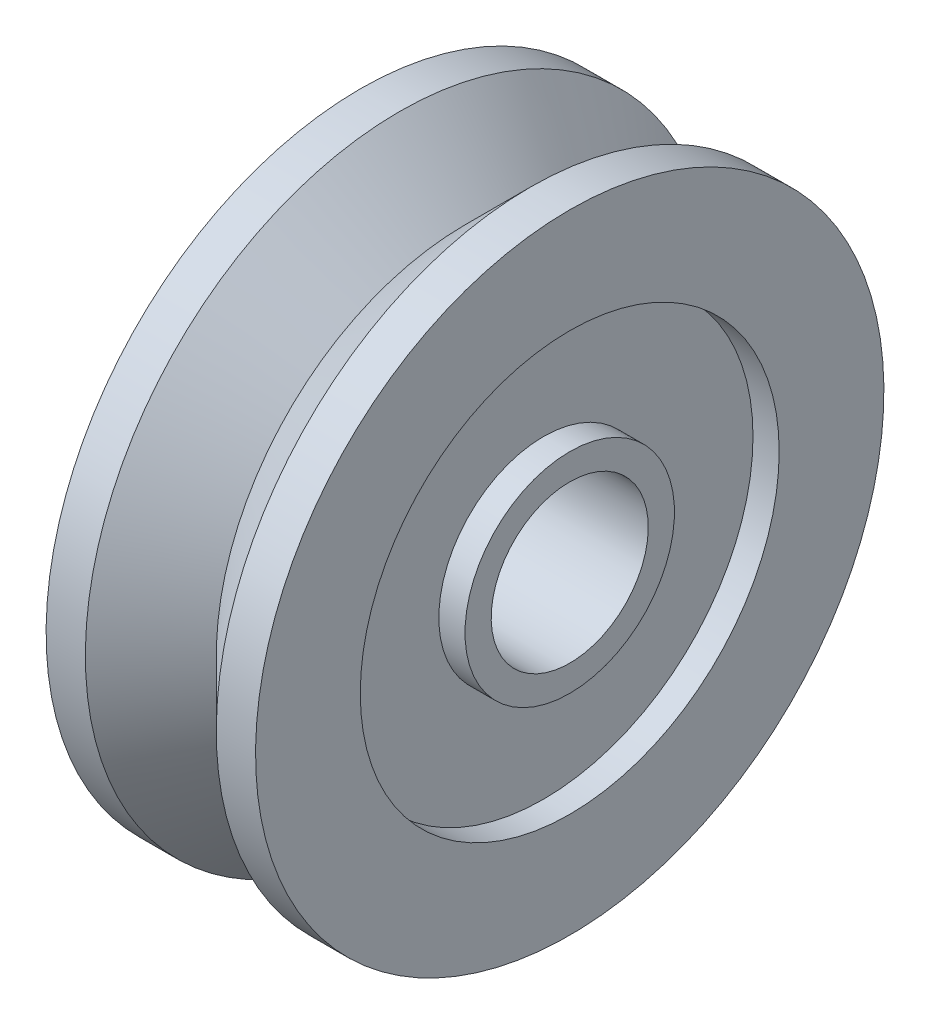
ISO-10303-21;
HEADER;
FILE_DESCRIPTION(('STEP AP214'),'2;1');
FILE_NAME('part.step','',(''),(''),'','','');
FILE_SCHEMA(('AUTOMOTIVE_DESIGN { 1 0 10303 214 1 1 1 1 }'));
ENDSEC;
DATA;
#1=APPLICATION_CONTEXT('core data for automotive mechanical design processes');
#2=APPLICATION_PROTOCOL_DEFINITION('international standard','automotive_design',2000,#1);
#3=PRODUCT_CONTEXT('',#1,'mechanical');
#4=PRODUCT('Part','Part','',(#3));
#5=PRODUCT_RELATED_PRODUCT_CATEGORY('part','',(#4));
#6=PRODUCT_DEFINITION_FORMATION('','',#4);
#7=PRODUCT_DEFINITION_CONTEXT('part definition',#1,'design');
#8=PRODUCT_DEFINITION('design','',#6,#7);
#9=PRODUCT_DEFINITION_SHAPE('','',#8);
#10=(LENGTH_UNIT() NAMED_UNIT(*) SI_UNIT(.MILLI.,.METRE.));
#11=(NAMED_UNIT(*) PLANE_ANGLE_UNIT() SI_UNIT($,.RADIAN.));
#12=(NAMED_UNIT(*) SI_UNIT($,.STERADIAN.) SOLID_ANGLE_UNIT());
#13=UNCERTAINTY_MEASURE_WITH_UNIT(LENGTH_MEASURE(1.E-05),#10,'distance_accuracy_value','');
#14=(GEOMETRIC_REPRESENTATION_CONTEXT(3) GLOBAL_UNCERTAINTY_ASSIGNED_CONTEXT((#13)) GLOBAL_UNIT_ASSIGNED_CONTEXT((#10,
#11,#12)) REPRESENTATION_CONTEXT('',''));
#15=CARTESIAN_POINT('',(0.,0.,0.));
#16=DIRECTION('',(0.,0.,1.));
#17=DIRECTION('',(1.,0.,0.));
#18=AXIS2_PLACEMENT_3D('',#15,#16,#17);
#19=CARTESIAN_POINT('',(1.25,0.,0.));
#20=DIRECTION('',(1.,0.,0.));
#21=DIRECTION('',(0.,1.,0.));
#22=AXIS2_PLACEMENT_3D('',#19,#20,#21);
#23=CONICAL_SURFACE('',#22,6.,0.785398163397446);
#24=CARTESIAN_POINT('',(0.,0.,0.));
#25=DIRECTION('',(1.,0.,0.));
#26=DIRECTION('',(0.,1.,0.));
#27=AXIS2_PLACEMENT_3D('',#24,#25,#26);
#28=CIRCLE('',#27,4.75000000000001);
#29=CARTESIAN_POINT('',(0.,4.75000000000001,0.));
#30=VERTEX_POINT('',#29);
#31=EDGE_CURVE('E10',#30,#30,#28,.T.);
#32=ORIENTED_EDGE('',*,*,#31,.T.);
#33=EDGE_LOOP('',(#32));
#34=FACE_BOUND('',#33,.T.);
#35=CARTESIAN_POINT('',(1.25,0.,0.));
#36=DIRECTION('',(1.,0.,0.));
#37=DIRECTION('',(0.,1.,0.));
#38=AXIS2_PLACEMENT_3D('',#35,#36,#37);
#39=CIRCLE('',#38,6.);
#40=CARTESIAN_POINT('',(1.25,6.,0.));
#41=VERTEX_POINT('',#40);
#42=EDGE_CURVE('E79',#41,#41,#39,.T.);
#43=ORIENTED_EDGE('',*,*,#42,.F.);
#44=EDGE_LOOP('',(#43));
#45=FACE_BOUND('',#44,.T.);
#46=ADVANCED_FACE('F30',(#34,#45),#23,.T.);
#47=CARTESIAN_POINT('',(0.,0.,0.));
#48=DIRECTION('',(-1.,0.,0.));
#49=DIRECTION('',(0.,-1.,0.));
#50=AXIS2_PLACEMENT_3D('',#47,#48,#49);
#51=CONICAL_SURFACE('',#50,4.75000000000001,0.785398163397446);
#52=CARTESIAN_POINT('',(-1.25,0.,0.));
#53=DIRECTION('',(1.,0.,0.));
#54=DIRECTION('',(0.,1.,0.));
#55=AXIS2_PLACEMENT_3D('',#52,#53,#54);
#56=CIRCLE('',#55,6.);
#57=CARTESIAN_POINT('',(-1.25,6.,0.));
#58=VERTEX_POINT('',#57);
#59=EDGE_CURVE('E36',#58,#58,#56,.T.);
#60=ORIENTED_EDGE('',*,*,#59,.T.);
#61=EDGE_LOOP('',(#60));
#62=FACE_BOUND('',#61,.T.);
#63=ORIENTED_EDGE('',*,*,#31,.F.);
#64=EDGE_LOOP('',(#63));
#65=FACE_BOUND('',#64,.T.);
#66=ADVANCED_FACE('F87',(#62,#65),#51,.T.);
#67=CARTESIAN_POINT('',(0.,0.,0.));
#68=DIRECTION('',(1.,0.,0.));
#69=DIRECTION('',(0.,1.,0.));
#70=AXIS2_PLACEMENT_3D('',#67,#68,#69);
#71=CYLINDRICAL_SURFACE('',#70,6.);
#72=CARTESIAN_POINT('',(-2.,0.,0.));
#73=DIRECTION('',(1.,0.,0.));
#74=DIRECTION('',(0.,1.,0.));
#75=AXIS2_PLACEMENT_3D('',#72,#73,#74);
#76=CIRCLE('',#75,6.);
#77=CARTESIAN_POINT('',(-2.,6.,0.));
#78=VERTEX_POINT('',#77);
#79=EDGE_CURVE('E40',#78,#78,#76,.T.);
#80=ORIENTED_EDGE('',*,*,#79,.T.);
#81=EDGE_LOOP('',(#80));
#82=FACE_BOUND('',#81,.T.);
#83=ORIENTED_EDGE('',*,*,#59,.F.);
#84=EDGE_LOOP('',(#83));
#85=FACE_BOUND('',#84,.T.);
#86=ADVANCED_FACE('F91',(#82,#85),#71,.T.);
#87=CARTESIAN_POINT('',(-2.,6.,0.));
#88=DIRECTION('',(-1.,0.,0.));
#89=DIRECTION('',(0.,-1.,0.));
#90=AXIS2_PLACEMENT_3D('',#87,#88,#89);
#91=PLANE('',#90);
#92=CARTESIAN_POINT('',(-2.,0.,0.));
#93=DIRECTION('',(1.,0.,0.));
#94=DIRECTION('',(0.,1.,0.));
#95=AXIS2_PLACEMENT_3D('',#92,#93,#94);
#96=CIRCLE('',#95,4.);
#97=CARTESIAN_POINT('',(-2.,4.,0.));
#98=VERTEX_POINT('',#97);
#99=EDGE_CURVE('E44',#98,#98,#96,.T.);
#100=ORIENTED_EDGE('',*,*,#99,.T.);
#101=EDGE_LOOP('',(#100));
#102=FACE_BOUND('',#101,.T.);
#103=ORIENTED_EDGE('',*,*,#79,.F.);
#104=EDGE_LOOP('',(#103));
#105=FACE_BOUND('',#104,.T.);
#106=ADVANCED_FACE('F95',(#102,#105),#91,.T.);
#107=CARTESIAN_POINT('',(0.,0.,0.));
#108=DIRECTION('',(1.,0.,0.));
#109=DIRECTION('',(0.,1.,0.));
#110=AXIS2_PLACEMENT_3D('',#107,#108,#109);
#111=CYLINDRICAL_SURFACE('',#110,4.);
#112=CARTESIAN_POINT('',(-1.5,0.,0.));
#113=DIRECTION('',(1.,0.,0.));
#114=DIRECTION('',(0.,1.,0.));
#115=AXIS2_PLACEMENT_3D('',#112,#113,#114);
#116=CIRCLE('',#115,4.);
#117=CARTESIAN_POINT('',(-1.5,4.,0.));
#118=VERTEX_POINT('',#117);
#119=EDGE_CURVE('E49',#118,#118,#116,.T.);
#120=ORIENTED_EDGE('',*,*,#119,.T.);
#121=EDGE_LOOP('',(#120));
#122=FACE_BOUND('',#121,.T.);
#123=ORIENTED_EDGE('',*,*,#99,.F.);
#124=EDGE_LOOP('',(#123));
#125=FACE_BOUND('',#124,.T.);
#126=ADVANCED_FACE('F102',(#122,#125),#111,.F.);
#127=CARTESIAN_POINT('',(-1.5,4.,0.));
#128=DIRECTION('',(-1.,0.,0.));
#129=DIRECTION('',(0.,-1.,0.));
#130=AXIS2_PLACEMENT_3D('',#127,#128,#129);
#131=PLANE('',#130);
#132=CARTESIAN_POINT('',(-1.5,0.,0.));
#133=DIRECTION('',(1.,0.,0.));
#134=DIRECTION('',(0.,1.,0.));
#135=AXIS2_PLACEMENT_3D('',#132,#133,#134);
#136=CIRCLE('',#135,2.);
#137=CARTESIAN_POINT('',(-1.5,2.,0.));
#138=VERTEX_POINT('',#137);
#139=EDGE_CURVE('E52',#138,#138,#136,.T.);
#140=ORIENTED_EDGE('',*,*,#139,.T.);
#141=EDGE_LOOP('',(#140));
#142=FACE_BOUND('',#141,.T.);
#143=ORIENTED_EDGE('',*,*,#119,.F.);
#144=EDGE_LOOP('',(#143));
#145=FACE_BOUND('',#144,.T.);
#146=ADVANCED_FACE('F106',(#142,#145),#131,.T.);
#147=CARTESIAN_POINT('',(0.,0.,0.));
#148=DIRECTION('',(1.,0.,0.));
#149=DIRECTION('',(0.,1.,0.));
#150=AXIS2_PLACEMENT_3D('',#147,#148,#149);
#151=CYLINDRICAL_SURFACE('',#150,2.);
#152=CARTESIAN_POINT('',(-2.,0.,0.));
#153=DIRECTION('',(1.,0.,0.));
#154=DIRECTION('',(0.,1.,0.));
#155=AXIS2_PLACEMENT_3D('',#152,#153,#154);
#156=CIRCLE('',#155,2.);
#157=CARTESIAN_POINT('',(-2.,2.,0.));
#158=VERTEX_POINT('',#157);
#159=EDGE_CURVE('E55',#158,#158,#156,.T.);
#160=ORIENTED_EDGE('',*,*,#159,.T.);
#161=EDGE_LOOP('',(#160));
#162=FACE_BOUND('',#161,.T.);
#163=ORIENTED_EDGE('',*,*,#139,.F.);
#164=EDGE_LOOP('',(#163));
#165=FACE_BOUND('',#164,.T.);
#166=ADVANCED_FACE('F110',(#162,#165),#151,.T.);
#167=CARTESIAN_POINT('',(-2.,2.,0.));
#168=DIRECTION('',(-1.,0.,0.));
#169=DIRECTION('',(0.,-1.,0.));
#170=AXIS2_PLACEMENT_3D('',#167,#168,#169);
#171=PLANE('',#170);
#172=CARTESIAN_POINT('',(-2.,0.,0.));
#173=DIRECTION('',(1.,0.,0.));
#174=DIRECTION('',(0.,1.,0.));
#175=AXIS2_PLACEMENT_3D('',#172,#173,#174);
#176=CIRCLE('',#175,1.5);
#177=CARTESIAN_POINT('',(-2.,1.5,0.));
#178=VERTEX_POINT('',#177);
#179=EDGE_CURVE('E58',#178,#178,#176,.T.);
#180=ORIENTED_EDGE('',*,*,#179,.T.);
#181=EDGE_LOOP('',(#180));
#182=FACE_BOUND('',#181,.T.);
#183=ORIENTED_EDGE('',*,*,#159,.F.);
#184=EDGE_LOOP('',(#183));
#185=FACE_BOUND('',#184,.T.);
#186=ADVANCED_FACE('F114',(#182,#185),#171,.T.);
#187=CARTESIAN_POINT('',(0.,0.,0.));
#188=DIRECTION('',(1.,0.,0.));
#189=DIRECTION('',(0.,1.,0.));
#190=AXIS2_PLACEMENT_3D('',#187,#188,#189);
#191=CYLINDRICAL_SURFACE('',#190,1.5);
#192=CARTESIAN_POINT('',(2.,0.,0.));
#193=DIRECTION('',(1.,0.,0.));
#194=DIRECTION('',(0.,1.,0.));
#195=AXIS2_PLACEMENT_3D('',#192,#193,#194);
#196=CIRCLE('',#195,1.5);
#197=CARTESIAN_POINT('',(2.,1.5,0.));
#198=VERTEX_POINT('',#197);
#199=EDGE_CURVE('E61',#198,#198,#196,.T.);
#200=ORIENTED_EDGE('',*,*,#199,.T.);
#201=EDGE_LOOP('',(#200));
#202=FACE_BOUND('',#201,.T.);
#203=ORIENTED_EDGE('',*,*,#179,.F.);
#204=EDGE_LOOP('',(#203));
#205=FACE_BOUND('',#204,.T.);
#206=ADVANCED_FACE('F118',(#202,#205),#191,.F.);
#207=CARTESIAN_POINT('',(2.,2.,0.));
#208=DIRECTION('',(1.,0.,0.));
#209=DIRECTION('',(0.,1.,0.));
#210=AXIS2_PLACEMENT_3D('',#207,#208,#209);
#211=PLANE('',#210);
#212=CARTESIAN_POINT('',(2.,0.,0.));
#213=DIRECTION('',(1.,0.,0.));
#214=DIRECTION('',(0.,1.,0.));
#215=AXIS2_PLACEMENT_3D('',#212,#213,#214);
#216=CIRCLE('',#215,2.);
#217=CARTESIAN_POINT('',(2.,2.,0.));
#218=VERTEX_POINT('',#217);
#219=EDGE_CURVE('E64',#218,#218,#216,.T.);
#220=ORIENTED_EDGE('',*,*,#219,.T.);
#221=EDGE_LOOP('',(#220));
#222=FACE_BOUND('',#221,.T.);
#223=ORIENTED_EDGE('',*,*,#199,.F.);
#224=EDGE_LOOP('',(#223));
#225=FACE_BOUND('',#224,.T.);
#226=ADVANCED_FACE('F122',(#222,#225),#211,.T.);
#227=CARTESIAN_POINT('',(0.,0.,0.));
#228=DIRECTION('',(1.,0.,0.));
#229=DIRECTION('',(0.,1.,0.));
#230=AXIS2_PLACEMENT_3D('',#227,#228,#229);
#231=CYLINDRICAL_SURFACE('',#230,2.);
#232=CARTESIAN_POINT('',(1.5,0.,0.));
#233=DIRECTION('',(1.,0.,0.));
#234=DIRECTION('',(0.,1.,0.));
#235=AXIS2_PLACEMENT_3D('',#232,#233,#234);
#236=CIRCLE('',#235,2.);
#237=CARTESIAN_POINT('',(1.5,2.,0.));
#238=VERTEX_POINT('',#237);
#239=EDGE_CURVE('E67',#238,#238,#236,.T.);
#240=ORIENTED_EDGE('',*,*,#239,.T.);
#241=EDGE_LOOP('',(#240));
#242=FACE_BOUND('',#241,.T.);
#243=ORIENTED_EDGE('',*,*,#219,.F.);
#244=EDGE_LOOP('',(#243));
#245=FACE_BOUND('',#244,.T.);
#246=ADVANCED_FACE('F126',(#242,#245),#231,.T.);
#247=CARTESIAN_POINT('',(1.5,4.,0.));
#248=DIRECTION('',(1.,0.,0.));
#249=DIRECTION('',(0.,1.,0.));
#250=AXIS2_PLACEMENT_3D('',#247,#248,#249);
#251=PLANE('',#250);
#252=CARTESIAN_POINT('',(1.5,0.,0.));
#253=DIRECTION('',(1.,0.,0.));
#254=DIRECTION('',(0.,1.,0.));
#255=AXIS2_PLACEMENT_3D('',#252,#253,#254);
#256=CIRCLE('',#255,4.);
#257=CARTESIAN_POINT('',(1.5,4.,0.));
#258=VERTEX_POINT('',#257);
#259=EDGE_CURVE('E70',#258,#258,#256,.T.);
#260=ORIENTED_EDGE('',*,*,#259,.T.);
#261=EDGE_LOOP('',(#260));
#262=FACE_BOUND('',#261,.T.);
#263=ORIENTED_EDGE('',*,*,#239,.F.);
#264=EDGE_LOOP('',(#263));
#265=FACE_BOUND('',#264,.T.);
#266=ADVANCED_FACE('F130',(#262,#265),#251,.T.);
#267=CARTESIAN_POINT('',(0.,0.,0.));
#268=DIRECTION('',(1.,0.,0.));
#269=DIRECTION('',(0.,1.,0.));
#270=AXIS2_PLACEMENT_3D('',#267,#268,#269);
#271=CYLINDRICAL_SURFACE('',#270,4.);
#272=CARTESIAN_POINT('',(2.,0.,0.));
#273=DIRECTION('',(1.,0.,0.));
#274=DIRECTION('',(0.,1.,0.));
#275=AXIS2_PLACEMENT_3D('',#272,#273,#274);
#276=CIRCLE('',#275,4.);
#277=CARTESIAN_POINT('',(2.,4.,0.));
#278=VERTEX_POINT('',#277);
#279=EDGE_CURVE('E73',#278,#278,#276,.T.);
#280=ORIENTED_EDGE('',*,*,#279,.T.);
#281=EDGE_LOOP('',(#280));
#282=FACE_BOUND('',#281,.T.);
#283=ORIENTED_EDGE('',*,*,#259,.F.);
#284=EDGE_LOOP('',(#283));
#285=FACE_BOUND('',#284,.T.);
#286=ADVANCED_FACE('F134',(#282,#285),#271,.F.);
#287=CARTESIAN_POINT('',(2.,6.,0.));
#288=DIRECTION('',(1.,0.,0.));
#289=DIRECTION('',(0.,1.,0.));
#290=AXIS2_PLACEMENT_3D('',#287,#288,#289);
#291=PLANE('',#290);
#292=CARTESIAN_POINT('',(2.,0.,0.));
#293=DIRECTION('',(1.,0.,0.));
#294=DIRECTION('',(0.,1.,0.));
#295=AXIS2_PLACEMENT_3D('',#292,#293,#294);
#296=CIRCLE('',#295,6.);
#297=CARTESIAN_POINT('',(2.,6.,0.));
#298=VERTEX_POINT('',#297);
#299=EDGE_CURVE('E76',#298,#298,#296,.T.);
#300=ORIENTED_EDGE('',*,*,#299,.T.);
#301=EDGE_LOOP('',(#300));
#302=FACE_BOUND('',#301,.T.);
#303=ORIENTED_EDGE('',*,*,#279,.F.);
#304=EDGE_LOOP('',(#303));
#305=FACE_BOUND('',#304,.T.);
#306=ADVANCED_FACE('F138',(#302,#305),#291,.T.);
#307=CARTESIAN_POINT('',(0.,0.,0.));
#308=DIRECTION('',(1.,0.,0.));
#309=DIRECTION('',(0.,1.,0.));
#310=AXIS2_PLACEMENT_3D('',#307,#308,#309);
#311=CYLINDRICAL_SURFACE('',#310,6.);
#312=ORIENTED_EDGE('',*,*,#42,.T.);
#313=EDGE_LOOP('',(#312));
#314=FACE_BOUND('',#313,.T.);
#315=ORIENTED_EDGE('',*,*,#299,.F.);
#316=EDGE_LOOP('',(#315));
#317=FACE_BOUND('',#316,.T.);
#318=ADVANCED_FACE('F83',(#314,#317),#311,.T.);
#319=CLOSED_SHELL('',(#46,#66,#86,#106,#126,#146,#166,#186,#206,#226,#246,#266,#286,#306,#318));
#320=MANIFOLD_SOLID_BREP('B2',#319);
#321=ADVANCED_BREP_SHAPE_REPRESENTATION('',(#18,#320),#14);
#322=SHAPE_DEFINITION_REPRESENTATION(#9,#321);
ENDSEC;
END-ISO-10303-21;
